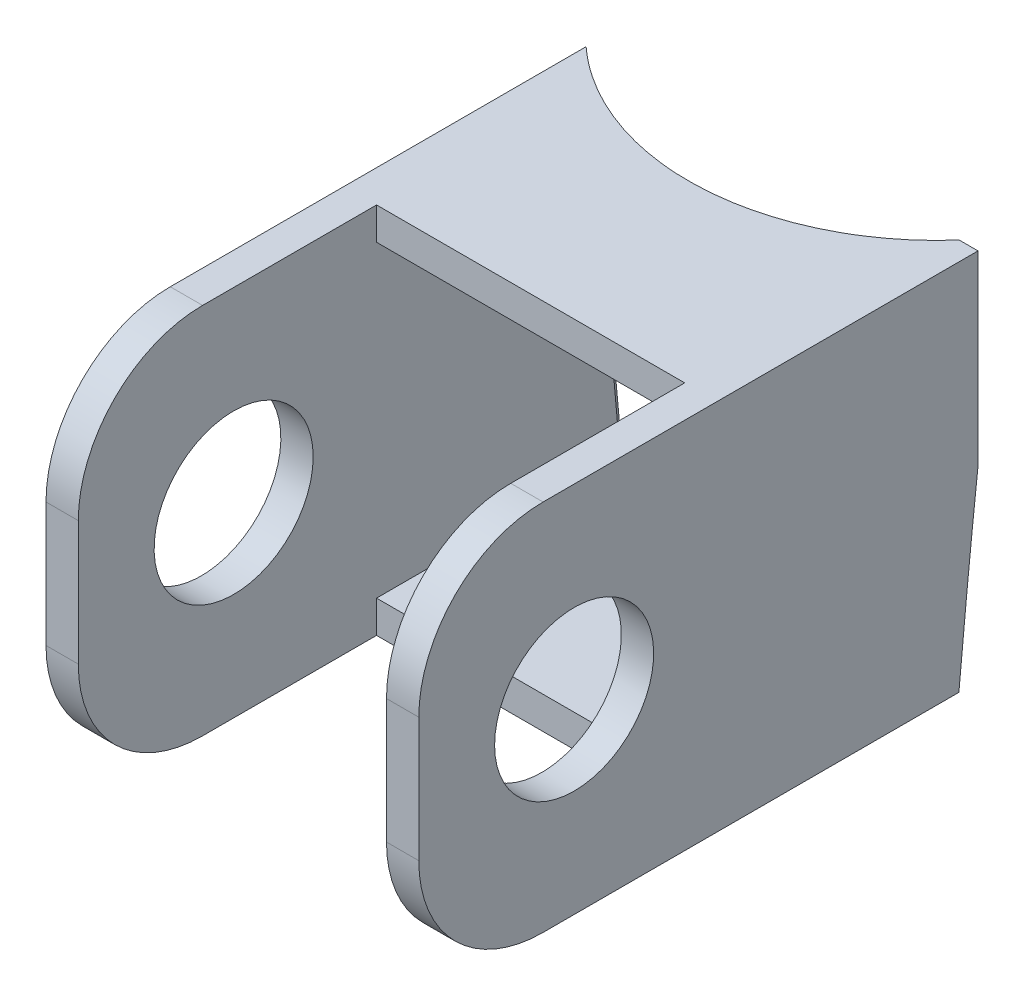
ISO-10303-21;
HEADER;
FILE_DESCRIPTION(('STEP AP214'),'2;1');
FILE_NAME('part.step','',(''),(''),'','','');
FILE_SCHEMA(('AUTOMOTIVE_DESIGN { 1 0 10303 214 1 1 1 1 }'));
ENDSEC;
DATA;
#1=APPLICATION_CONTEXT('core data for automotive mechanical design processes');
#2=APPLICATION_PROTOCOL_DEFINITION('international standard','automotive_design',2000,#1);
#3=PRODUCT_CONTEXT('',#1,'mechanical');
#4=PRODUCT('Part','Part','',(#3));
#5=PRODUCT_RELATED_PRODUCT_CATEGORY('part','',(#4));
#6=PRODUCT_DEFINITION_FORMATION('','',#4);
#7=PRODUCT_DEFINITION_CONTEXT('part definition',#1,'design');
#8=PRODUCT_DEFINITION('design','',#6,#7);
#9=PRODUCT_DEFINITION_SHAPE('','',#8);
#10=(LENGTH_UNIT() NAMED_UNIT(*) SI_UNIT(.MILLI.,.METRE.));
#11=(NAMED_UNIT(*) PLANE_ANGLE_UNIT() SI_UNIT($,.RADIAN.));
#12=(NAMED_UNIT(*) SI_UNIT($,.STERADIAN.) SOLID_ANGLE_UNIT());
#13=UNCERTAINTY_MEASURE_WITH_UNIT(LENGTH_MEASURE(1.E-05),#10,'distance_accuracy_value','');
#14=(GEOMETRIC_REPRESENTATION_CONTEXT(3) GLOBAL_UNCERTAINTY_ASSIGNED_CONTEXT((#13)) GLOBAL_UNIT_ASSIGNED_CONTEXT((#10,
#11,#12)) REPRESENTATION_CONTEXT('',''));
#15=CARTESIAN_POINT('',(0.,0.,0.));
#16=DIRECTION('',(0.,0.,1.));
#17=DIRECTION('',(1.,0.,0.));
#18=AXIS2_PLACEMENT_3D('',#15,#16,#17);
#19=CARTESIAN_POINT('',(0.,0.,0.));
#20=DIRECTION('',(0.,0.,1.));
#21=DIRECTION('',(1.,0.,0.));
#22=AXIS2_PLACEMENT_3D('',#19,#20,#21);
#23=PLANE('',#22);
#24=DIRECTION('',(0.,1.,0.));
#25=VECTOR('',#24,1.);
#26=CARTESIAN_POINT('',(9.525,9.525,0.));
#27=LINE('',#26,#25);
#28=CARTESIAN_POINT('',(9.525,0.,0.));
#29=VERTEX_POINT('',#28);
#30=CARTESIAN_POINT('',(9.525,9.525,0.));
#31=VERTEX_POINT('',#30);
#32=EDGE_CURVE('E205',#29,#31,#27,.T.);
#33=ORIENTED_EDGE('',*,*,#32,.F.);
#34=DIRECTION('',(-0.10018806161207,0.994968518250912,0.));
#35=VECTOR('',#34,1.);
#36=CARTESIAN_POINT('',(10.5700983819051,-10.3788811934186,0.));
#37=LINE('',#36,#35);
#38=CARTESIAN_POINT('',(8.56588293312783,9.525,0.));
#39=VERTEX_POINT('',#38);
#40=EDGE_CURVE('E314',#29,#39,#37,.T.);
#41=ORIENTED_EDGE('',*,*,#40,.T.);
#42=DIRECTION('',(-1.,0.,0.));
#43=VECTOR('',#42,1.);
#44=CARTESIAN_POINT('',(-9.525,9.525,0.));
#45=LINE('',#44,#43);
#46=EDGE_CURVE('E215',#31,#39,#45,.T.);
#47=ORIENTED_EDGE('',*,*,#46,.F.);
#48=EDGE_LOOP('',(#33,#41,#47));
#49=FACE_BOUND('',#48,.T.);
#50=ADVANCED_FACE('F41',(#49),#23,.F.);
#51=CARTESIAN_POINT('',(0.,0.,28.575));
#52=DIRECTION('',(0.,0.,1.));
#53=DIRECTION('',(1.,0.,0.));
#54=AXIS2_PLACEMENT_3D('',#51,#52,#53);
#55=PLANE('',#54);
#56=DIRECTION('',(0.,-1.,0.));
#57=VECTOR('',#56,1.);
#58=CARTESIAN_POINT('',(-7.874,7.874,28.575));
#59=LINE('',#58,#57);
#60=CARTESIAN_POINT('',(-7.874,3.175,28.575));
#61=VERTEX_POINT('',#60);
#62=CARTESIAN_POINT('',(-7.874,-3.175,28.575));
#63=VERTEX_POINT('',#62);
#64=EDGE_CURVE('E193',#61,#63,#59,.T.);
#65=ORIENTED_EDGE('',*,*,#64,.F.);
#66=DIRECTION('',(-1.,0.,0.));
#67=VECTOR('',#66,1.);
#68=CARTESIAN_POINT('',(-9.525,3.175,28.575));
#69=LINE('',#68,#67);
#70=CARTESIAN_POINT('',(-9.525,3.175,28.575));
#71=VERTEX_POINT('',#70);
#72=EDGE_CURVE('E242',#61,#71,#69,.T.);
#73=ORIENTED_EDGE('',*,*,#72,.T.);
#74=DIRECTION('',(0.,-1.,0.));
#75=VECTOR('',#74,1.);
#76=CARTESIAN_POINT('',(-9.525,9.525,28.575));
#77=LINE('',#76,#75);
#78=CARTESIAN_POINT('',(-9.525,-3.175,28.575));
#79=VERTEX_POINT('',#78);
#80=EDGE_CURVE('E209',#71,#79,#77,.T.);
#81=ORIENTED_EDGE('',*,*,#80,.T.);
#82=DIRECTION('',(1.,0.,0.));
#83=VECTOR('',#82,1.);
#84=CARTESIAN_POINT('',(-7.874,-3.175,28.575));
#85=LINE('',#84,#83);
#86=EDGE_CURVE('E239',#79,#63,#85,.T.);
#87=ORIENTED_EDGE('',*,*,#86,.T.);
#88=EDGE_LOOP('',(#65,#73,#81,#87));
#89=FACE_BOUND('',#88,.T.);
#90=ADVANCED_FACE('F291',(#89),#55,.T.);
#91=DIRECTION('',(0.,1.,0.));
#92=VECTOR('',#91,1.);
#93=CARTESIAN_POINT('',(9.525,9.525,28.575));
#94=LINE('',#93,#92);
#95=CARTESIAN_POINT('',(9.525,-3.175,28.575));
#96=VERTEX_POINT('',#95);
#97=CARTESIAN_POINT('',(9.525,3.175,28.575));
#98=VERTEX_POINT('',#97);
#99=EDGE_CURVE('E206',#96,#98,#94,.T.);
#100=ORIENTED_EDGE('',*,*,#99,.T.);
#101=DIRECTION('',(-1.,0.,0.));
#102=VECTOR('',#101,1.);
#103=CARTESIAN_POINT('',(7.874,3.175,28.575));
#104=LINE('',#103,#102);
#105=CARTESIAN_POINT('',(7.874,3.175,28.575));
#106=VERTEX_POINT('',#105);
#107=EDGE_CURVE('E260',#98,#106,#104,.T.);
#108=ORIENTED_EDGE('',*,*,#107,.T.);
#109=DIRECTION('',(0.,1.,0.));
#110=VECTOR('',#109,1.);
#111=CARTESIAN_POINT('',(7.874,7.874,28.575));
#112=LINE('',#111,#110);
#113=CARTESIAN_POINT('',(7.874,-3.175,28.575));
#114=VERTEX_POINT('',#113);
#115=EDGE_CURVE('E198',#114,#106,#112,.T.);
#116=ORIENTED_EDGE('',*,*,#115,.F.);
#117=DIRECTION('',(1.,0.,0.));
#118=VECTOR('',#117,1.);
#119=CARTESIAN_POINT('',(9.525,-3.175,28.575));
#120=LINE('',#119,#118);
#121=EDGE_CURVE('E257',#114,#96,#120,.T.);
#122=ORIENTED_EDGE('',*,*,#121,.T.);
#123=EDGE_LOOP('',(#100,#108,#116,#122));
#124=FACE_BOUND('',#123,.T.);
#125=ADVANCED_FACE('F362',(#124),#55,.T.);
#126=DIRECTION('',(0.,-1.,0.));
#127=VECTOR('',#126,1.);
#128=CARTESIAN_POINT('',(-9.525,9.525,0.));
#129=LINE('',#128,#127);
#130=CARTESIAN_POINT('',(-9.525,0.,0.));
#131=VERTEX_POINT('',#130);
#132=CARTESIAN_POINT('',(-9.525,-9.525,0.));
#133=VERTEX_POINT('',#132);
#134=EDGE_CURVE('E218',#131,#133,#129,.T.);
#135=ORIENTED_EDGE('',*,*,#134,.F.);
#136=DIRECTION('',(-0.10018806161207,0.994968518250912,0.));
#137=VECTOR('',#136,1.);
#138=CARTESIAN_POINT('',(-8.47990161809487,-10.3788811934186,0.));
#139=LINE('',#138,#137);
#140=CARTESIAN_POINT('',(-8.56588293312783,-9.525,0.));
#141=VERTEX_POINT('',#140);
#142=EDGE_CURVE('E407',#131,#141,#139,.F.);
#143=ORIENTED_EDGE('',*,*,#142,.T.);
#144=DIRECTION('',(1.,0.,0.));
#145=VECTOR('',#144,1.);
#146=CARTESIAN_POINT('',(-9.525,-9.525,0.));
#147=LINE('',#146,#145);
#148=EDGE_CURVE('E210',#133,#141,#147,.T.);
#149=ORIENTED_EDGE('',*,*,#148,.F.);
#150=EDGE_LOOP('',(#135,#143,#149));
#151=FACE_BOUND('',#150,.T.);
#152=ADVANCED_FACE('F382',(#151),#23,.F.);
#153=CARTESIAN_POINT('',(9.525,9.525,28.575));
#154=DIRECTION('',(-1.,0.,0.));
#155=DIRECTION('',(0.,-1.,0.));
#156=AXIS2_PLACEMENT_3D('',#153,#154,#155);
#157=PLANE('',#156);
#158=CARTESIAN_POINT('',(9.52500000000001,0.,20.6375));
#159=DIRECTION('',(-1.,0.,0.));
#160=DIRECTION('',(0.,-1.,0.));
#161=AXIS2_PLACEMENT_3D('',#158,#159,#160);
#162=CIRCLE('',#161,4.064);
#163=CARTESIAN_POINT('',(9.52500000000001,-4.064,20.6375));
#164=VERTEX_POINT('',#163);
#165=EDGE_CURVE('E418',#164,#164,#162,.T.);
#166=ORIENTED_EDGE('',*,*,#165,.T.);
#167=EDGE_LOOP('',(#166));
#168=FACE_BOUND('',#167,.T.);
#169=DIRECTION('',(0.,0.,-1.));
#170=VECTOR('',#169,1.);
#171=CARTESIAN_POINT('',(9.525,-9.525,28.575));
#172=LINE('',#171,#170);
#173=CARTESIAN_POINT('',(9.525,-9.525,22.225));
#174=VERTEX_POINT('',#173);
#175=CARTESIAN_POINT('',(9.525,-9.525,0.97607413643289));
#176=VERTEX_POINT('',#175);
#177=EDGE_CURVE('E213',#174,#176,#172,.T.);
#178=ORIENTED_EDGE('',*,*,#177,.T.);
#179=CARTESIAN_POINT('',(9.52499999999994,-9.525,0.976074136432891));
#180=CARTESIAN_POINT('',(9.52499999999998,-9.1277064272393,0.939526221320908));
#181=CARTESIAN_POINT('',(9.525,-8.73045552857944,0.902513399261914));
#182=CARTESIAN_POINT('',(9.52500000000001,-7.93605318233662,0.82752374373459));
#183=CARTESIAN_POINT('',(9.52500000000001,-7.5389017328361,0.789546930576719));
#184=CARTESIAN_POINT('',(9.525,-6.74470163512735,0.712594138451446));
#185=CARTESIAN_POINT('',(9.525,-6.34765298546219,0.673618174527102));
#186=CARTESIAN_POINT('',(9.525,-5.55366224088991,0.59462844622898));
#187=CARTESIAN_POINT('',(9.525,-5.15672014512228,0.554614690507607));
#188=CARTESIAN_POINT('',(9.525,-4.36294530639579,0.473507701993614));
#189=CARTESIAN_POINT('',(9.525,-3.96611256368567,0.432414466765917));
#190=CARTESIAN_POINT('',(9.525,-3.17256247345392,0.349103506553159));
#191=CARTESIAN_POINT('',(9.525,-2.77584512670334,0.306885774221373));
#192=CARTESIAN_POINT('',(9.525,-1.98253104190467,0.221277161487796));
#193=CARTESIAN_POINT('',(9.525,-1.58593430572034,0.177886263804821));
#194=CARTESIAN_POINT('',(9.525,-0.792867409981158,0.0898769888508262));
#195=CARTESIAN_POINT('',(9.525,-0.396397253705394,0.045258582037538));
#196=CARTESIAN_POINT('',(9.525,0.,0.));
#197=B_SPLINE_CURVE_WITH_KNOTS('',3,(#179,#180,#181,#182,#183,#184,#185,#186,#187,#188,#189,
#190,#191,#192,#193,#194,#195,#196),.UNSPECIFIED.,.F.,.F.,(4,2,2,2,2,2,2,2,4),(0.,
1.19691314331896,2.39380108961143,3.59067102631726,4.78753098753862,5.98439364885425,
7.18126413160279,8.37815225433768,9.57506920763329),.UNSPECIFIED.);
#198=EDGE_CURVE('E62',#176,#29,#197,.T.);
#199=ORIENTED_EDGE('',*,*,#198,.T.);
#200=ORIENTED_EDGE('',*,*,#32,.T.);
#201=DIRECTION('',(0.,0.,-1.));
#202=VECTOR('',#201,1.);
#203=CARTESIAN_POINT('',(9.525,9.525,28.575));
#204=LINE('',#203,#202);
#205=CARTESIAN_POINT('',(9.525,9.525,22.225));
#206=VERTEX_POINT('',#205);
#207=EDGE_CURVE('E230',#206,#31,#204,.T.);
#208=ORIENTED_EDGE('',*,*,#207,.F.);
#209=CARTESIAN_POINT('',(9.525,3.175,22.225));
#210=DIRECTION('',(-1.,0.,0.));
#211=DIRECTION('',(0.,-1.,0.));
#212=AXIS2_PLACEMENT_3D('',#209,#210,#211);
#213=CIRCLE('',#212,6.35);
#214=EDGE_CURVE('E269',#206,#98,#213,.F.);
#215=ORIENTED_EDGE('',*,*,#214,.T.);
#216=ORIENTED_EDGE('',*,*,#99,.F.);
#217=CARTESIAN_POINT('',(9.525,-3.175,22.225));
#218=DIRECTION('',(-1.,0.,0.));
#219=DIRECTION('',(0.,-1.,0.));
#220=AXIS2_PLACEMENT_3D('',#217,#218,#219);
#221=CIRCLE('',#220,6.35);
#222=EDGE_CURVE('E267',#96,#174,#221,.F.);
#223=ORIENTED_EDGE('',*,*,#222,.T.);
#224=EDGE_LOOP('',(#178,#199,#200,#208,#215,#216,#223));
#225=FACE_BOUND('',#224,.T.);
#226=ADVANCED_FACE('F389',(#168,#225),#157,.F.);
#227=CARTESIAN_POINT('',(-9.525,9.525,28.575));
#228=DIRECTION('',(0.,-1.,0.));
#229=DIRECTION('',(0.,0.,-1.));
#230=AXIS2_PLACEMENT_3D('',#227,#228,#229);
#231=PLANE('',#230);
#232=ORIENTED_EDGE('',*,*,#46,.T.);
#233=CARTESIAN_POINT('',(8.56588293312783,9.525,0.));
#234=CARTESIAN_POINT('',(8.33312014434595,9.525,0.263982900761339));
#235=CARTESIAN_POINT('',(8.089335336482,9.525,0.518238316273924));
#236=CARTESIAN_POINT('',(7.58152867443279,9.525,1.00564061623721));
#237=CARTESIAN_POINT('',(7.31750783397583,9.525,1.23878855679668));
#238=CARTESIAN_POINT('',(6.77100507951902,9.525,1.68235507531954));
#239=CARTESIAN_POINT('',(6.48852266883857,9.525,1.892773041363));
#240=CARTESIAN_POINT('',(5.90706329338011,9.525,2.28942650659204));
#241=CARTESIAN_POINT('',(5.60808639069201,9.525,2.47566209679804));
#242=CARTESIAN_POINT('',(4.99576743042289,9.525,2.82262503797814));
#243=CARTESIAN_POINT('',(4.68242853888995,9.525,2.98335797639248));
#244=CARTESIAN_POINT('',(4.04334672833901,9.525,3.27832109112494));
#245=CARTESIAN_POINT('',(3.71759838003734,9.525,3.41253950442194));
#246=CARTESIAN_POINT('',(3.05607927194578,9.525,3.65345742027777));
#247=CARTESIAN_POINT('',(2.72030848101994,9.525,3.76015683733551));
#248=CARTESIAN_POINT('',(2.04121430410955,9.525,3.94525728254998));
#249=CARTESIAN_POINT('',(1.69789437433722,9.525,4.02367098585546));
#250=CARTESIAN_POINT('',(1.00579212416971,9.525,4.15175361058599));
#251=CARTESIAN_POINT('',(0.657007508166302,9.525,4.20141010003733));
#252=CARTESIAN_POINT('',(-0.043380174782652,9.525,4.27156660801607));
#253=CARTESIAN_POINT('',(-0.394982012245475,9.525,4.29207871564242));
#254=CARTESIAN_POINT('',(-0.922091921803949,9.525,4.3008973957611));
#255=CARTESIAN_POINT('',(-1.09747898472358,9.525,4.30019642551258));
#256=CARTESIAN_POINT('',(-1.448073529362,9.525,4.29153494649575));
#257=CARTESIAN_POINT('',(-1.62328101131704,9.525,4.28357444729002));
#258=CARTESIAN_POINT('',(-2.14931126324412,9.525,4.24873788543539));
#259=CARTESIAN_POINT('',(-2.49947038172184,9.525,4.21088880985538));
#260=CARTESIAN_POINT('',(-3.19553926818018,9.525,4.10623290468059));
#261=CARTESIAN_POINT('',(-3.54144718799825,9.525,4.03941390889134));
#262=CARTESIAN_POINT('',(-4.2264561916853,9.525,3.87729346253786));
#263=CARTESIAN_POINT('',(-4.56555873254606,9.525,3.78199817952386));
#264=CARTESIAN_POINT('',(-5.23467964451342,9.525,3.5635781769271));
#265=CARTESIAN_POINT('',(-5.56469790047024,9.525,3.44045310476403));
#266=CARTESIAN_POINT('',(-6.2173055243511,9.525,3.16556518349968));
#267=CARTESIAN_POINT('',(-6.53975640487693,9.525,3.01347337841236));
#268=CARTESIAN_POINT('',(-7.17075540485726,9.525,2.68272082800671));
#269=CARTESIAN_POINT('',(-7.47930255408311,9.525,2.50405823225791));
#270=CARTESIAN_POINT('',(-8.08922437627035,9.525,2.11572938455417));
#271=CARTESIAN_POINT('',(-8.39011306744058,9.525,1.90529928687816));
#272=CARTESIAN_POINT('',(-8.97259459599483,9.525,1.45920499152843));
#273=CARTESIAN_POINT('',(-9.25418613802434,9.525,1.22353910257428));
#274=CARTESIAN_POINT('',(-9.52499999999984,9.525,0.976074136432908));
#275=B_SPLINE_CURVE_WITH_KNOTS('',3,(#233,#234,#235,#236,#237,#238,#239,#240,#241,#242,#243,
#244,#245,#246,#247,#248,#249,#250,#251,#252,#253,#254,#255,#256,#257,#258,#259,#260,#261,#262,
#263,#264,#265,#266,#267,#268,#269,#270,#271,#272,#273,#274),.UNSPECIFIED.,.F.,.F.,(4,2,2,2,2,2,
2,2,2,2,2,2,2,2,2,2,2,2,2,2,4),(0.,1.05552304057624,2.11099323902187,3.1664918449947,
4.22198647804487,5.27724953983794,6.33297971697848,7.38871317421636,8.44397295590957,
9.49968859496093,10.554966194854,11.0810018819451,11.6070368761185,12.6623116942617,
13.7180301150609,14.773520048107,15.8290233540838,16.897317406298,17.9656858910117,
19.0658181266106,20.1660241382982),.UNSPECIFIED.);
#276=CARTESIAN_POINT('',(-9.5249999999999,9.52500000000001,0.976074136432989));
#277=VERTEX_POINT('',#276);
#278=EDGE_CURVE('E307',#39,#277,#275,.T.);
#279=ORIENTED_EDGE('',*,*,#278,.T.);
#280=DIRECTION('',(0.,0.,-1.));
#281=VECTOR('',#280,1.);
#282=CARTESIAN_POINT('',(-9.525,9.525,28.575));
#283=LINE('',#282,#281);
#284=CARTESIAN_POINT('',(-9.525,9.525,22.225));
#285=VERTEX_POINT('',#284);
#286=EDGE_CURVE('E227',#285,#277,#283,.T.);
#287=ORIENTED_EDGE('',*,*,#286,.F.);
#288=DIRECTION('',(-1.,0.,0.));
#289=VECTOR('',#288,1.);
#290=CARTESIAN_POINT('',(-7.874,9.525,22.225));
#291=LINE('',#290,#289);
#292=CARTESIAN_POINT('',(-7.874,9.525,22.225));
#293=VERTEX_POINT('',#292);
#294=EDGE_CURVE('E251',#285,#293,#291,.F.);
#295=ORIENTED_EDGE('',*,*,#294,.T.);
#296=DIRECTION('',(0.,0.,-1.));
#297=VECTOR('',#296,1.);
#298=CARTESIAN_POINT('',(-7.874,9.525,28.575));
#299=LINE('',#298,#297);
#300=CARTESIAN_POINT('',(-7.874,9.525,13.335));
#301=VERTEX_POINT('',#300);
#302=EDGE_CURVE('E299',#293,#301,#299,.T.);
#303=ORIENTED_EDGE('',*,*,#302,.T.);
#304=DIRECTION('',(1.,0.,0.));
#305=VECTOR('',#304,1.);
#306=CARTESIAN_POINT('',(-7.874,9.525,13.335));
#307=LINE('',#306,#305);
#308=CARTESIAN_POINT('',(7.874,9.525,13.335));
#309=VERTEX_POINT('',#308);
#310=EDGE_CURVE('E312',#301,#309,#307,.T.);
#311=ORIENTED_EDGE('',*,*,#310,.T.);
#312=DIRECTION('',(0.,0.,1.));
#313=VECTOR('',#312,1.);
#314=CARTESIAN_POINT('',(7.874,9.525,28.575));
#315=LINE('',#314,#313);
#316=CARTESIAN_POINT('',(7.874,9.525,22.225));
#317=VERTEX_POINT('',#316);
#318=EDGE_CURVE('E438',#309,#317,#315,.T.);
#319=ORIENTED_EDGE('',*,*,#318,.T.);
#320=DIRECTION('',(-1.,0.,0.));
#321=VECTOR('',#320,1.);
#322=CARTESIAN_POINT('',(9.525,9.525,22.225));
#323=LINE('',#322,#321);
#324=EDGE_CURVE('E249',#317,#206,#323,.F.);
#325=ORIENTED_EDGE('',*,*,#324,.T.);
#326=ORIENTED_EDGE('',*,*,#207,.T.);
#327=EDGE_LOOP('',(#232,#279,#287,#295,#303,#311,#319,#325,#326));
#328=FACE_BOUND('',#327,.T.);
#329=ADVANCED_FACE('F306',(#328),#231,.F.);
#330=CARTESIAN_POINT('',(-9.525,9.525,28.575));
#331=DIRECTION('',(1.,0.,0.));
#332=DIRECTION('',(0.,1.,0.));
#333=AXIS2_PLACEMENT_3D('',#330,#331,#332);
#334=PLANE('',#333);
#335=CARTESIAN_POINT('',(-9.525,0.,20.6375));
#336=DIRECTION('',(1.,0.,0.));
#337=DIRECTION('',(0.,1.,0.));
#338=AXIS2_PLACEMENT_3D('',#335,#336,#337);
#339=CIRCLE('',#338,4.064);
#340=CARTESIAN_POINT('',(-9.525,4.064,20.6375));
#341=VERTEX_POINT('',#340);
#342=EDGE_CURVE('E237',#341,#341,#339,.T.);
#343=ORIENTED_EDGE('',*,*,#342,.T.);
#344=EDGE_LOOP('',(#343));
#345=FACE_BOUND('',#344,.T.);
#346=ORIENTED_EDGE('',*,*,#286,.T.);
#347=CARTESIAN_POINT('',(-9.5249999999999,9.52500000000001,0.976074136432989));
#348=CARTESIAN_POINT('',(-9.52499999999996,9.1277064272393,0.939526221320949));
#349=CARTESIAN_POINT('',(-9.52499999999999,8.73045552857944,0.90251339926193));
#350=CARTESIAN_POINT('',(-9.52500000000001,7.93605318233662,0.827523743734586));
#351=CARTESIAN_POINT('',(-9.525,7.53890173283609,0.789546930576719));
#352=CARTESIAN_POINT('',(-9.525,6.74470163512733,0.712594138451451));
#353=CARTESIAN_POINT('',(-9.525,6.34765298546217,0.673618174527107));
#354=CARTESIAN_POINT('',(-9.525,5.55366224088989,0.594628446228984));
#355=CARTESIAN_POINT('',(-9.525,5.15672014512225,0.55461469050761));
#356=CARTESIAN_POINT('',(-9.525,4.36294530639576,0.473507701993616));
#357=CARTESIAN_POINT('',(-9.525,3.96611256368563,0.432414466765919));
#358=CARTESIAN_POINT('',(-9.525,3.17256247345387,0.349103506553161));
#359=CARTESIAN_POINT('',(-9.525,2.77584512670329,0.306885774221375));
#360=CARTESIAN_POINT('',(-9.525,1.98253104190462,0.221277161487796));
#361=CARTESIAN_POINT('',(-9.525,1.58593430572028,0.17788626380482));
#362=CARTESIAN_POINT('',(-9.525,0.792867409981093,0.0898769888508242));
#363=CARTESIAN_POINT('',(-9.525,0.396397253705325,0.0452585820375363));
#364=CARTESIAN_POINT('',(-9.52499999999999,0.,0.));
#365=B_SPLINE_CURVE_WITH_KNOTS('',3,(#347,#348,#349,#350,#351,#352,#353,#354,#355,#356,#357,
#358,#359,#360,#361,#362,#363,#364),.UNSPECIFIED.,.F.,.F.,(4,2,2,2,2,2,2,2,4),(0.,
1.19691314331898,2.39380108961145,3.59067102631729,4.78753098753866,5.9843936488543,
7.18126413160286,8.37815225433775,9.57506920763337),.UNSPECIFIED.);
#366=EDGE_CURVE('E310',#277,#131,#365,.T.);
#367=ORIENTED_EDGE('',*,*,#366,.T.);
#368=ORIENTED_EDGE('',*,*,#134,.T.);
#369=DIRECTION('',(0.,0.,-1.));
#370=VECTOR('',#369,1.);
#371=CARTESIAN_POINT('',(-9.525,-9.525,28.575));
#372=LINE('',#371,#370);
#373=CARTESIAN_POINT('',(-9.525,-9.525,22.225));
#374=VERTEX_POINT('',#373);
#375=EDGE_CURVE('E224',#374,#133,#372,.T.);
#376=ORIENTED_EDGE('',*,*,#375,.F.);
#377=CARTESIAN_POINT('',(-9.525,-3.175,22.225));
#378=DIRECTION('',(1.,0.,0.));
#379=DIRECTION('',(0.,1.,0.));
#380=AXIS2_PLACEMENT_3D('',#377,#378,#379);
#381=CIRCLE('',#380,6.35);
#382=EDGE_CURVE('E245',#374,#79,#381,.F.);
#383=ORIENTED_EDGE('',*,*,#382,.T.);
#384=ORIENTED_EDGE('',*,*,#80,.F.);
#385=CARTESIAN_POINT('',(-9.525,3.175,22.225));
#386=DIRECTION('',(1.,0.,0.));
#387=DIRECTION('',(0.,1.,0.));
#388=AXIS2_PLACEMENT_3D('',#385,#386,#387);
#389=CIRCLE('',#388,6.35);
#390=EDGE_CURVE('E247',#71,#285,#389,.F.);
#391=ORIENTED_EDGE('',*,*,#390,.T.);
#392=EDGE_LOOP('',(#346,#367,#368,#376,#383,#384,#391));
#393=FACE_BOUND('',#392,.T.);
#394=ADVANCED_FACE('F283',(#345,#393),#334,.F.);
#395=CARTESIAN_POINT('',(-9.525,-9.525,28.575));
#396=DIRECTION('',(0.,1.,0.));
#397=DIRECTION('',(0.,0.,1.));
#398=AXIS2_PLACEMENT_3D('',#395,#396,#397);
#399=PLANE('',#398);
#400=ORIENTED_EDGE('',*,*,#148,.T.);
#401=CARTESIAN_POINT('',(-8.56588293312783,-9.525,0.));
#402=CARTESIAN_POINT('',(-8.33312014434595,-9.525,0.26398290076134));
#403=CARTESIAN_POINT('',(-8.089335336482,-9.525,0.518238316273925));
#404=CARTESIAN_POINT('',(-7.58152867443279,-9.525,1.00564061623721));
#405=CARTESIAN_POINT('',(-7.31750783397583,-9.525,1.23878855679668));
#406=CARTESIAN_POINT('',(-6.77100507951902,-9.525,1.68235507531954));
#407=CARTESIAN_POINT('',(-6.48852266883858,-9.525,1.892773041363));
#408=CARTESIAN_POINT('',(-5.90706329338011,-9.525,2.28942650659204));
#409=CARTESIAN_POINT('',(-5.60808639069201,-9.525,2.47566209679804));
#410=CARTESIAN_POINT('',(-4.9957674304229,-9.525,2.82262503797814));
#411=CARTESIAN_POINT('',(-4.68242853888995,-9.525,2.98335797639248));
#412=CARTESIAN_POINT('',(-4.04334672833902,-9.525,3.27832109112493));
#413=CARTESIAN_POINT('',(-3.71759838003735,-9.525,3.41253950442194));
#414=CARTESIAN_POINT('',(-3.05607927194579,-9.525,3.65345742027777));
#415=CARTESIAN_POINT('',(-2.72030848101995,-9.525,3.76015683733551));
#416=CARTESIAN_POINT('',(-2.04121430410956,-9.525,3.94525728254998));
#417=CARTESIAN_POINT('',(-1.69789437433723,-9.525,4.02367098585546));
#418=CARTESIAN_POINT('',(-1.00579212416972,-9.525,4.15175361058599));
#419=CARTESIAN_POINT('',(-0.657007508166316,-9.525,4.20141010003733));
#420=CARTESIAN_POINT('',(0.0433801747826377,-9.525,4.27156660801607));
#421=CARTESIAN_POINT('',(0.39498201224546,-9.525,4.29207871564242));
#422=CARTESIAN_POINT('',(0.922091921803934,-9.525,4.3008973957611));
#423=CARTESIAN_POINT('',(1.09747898472356,-9.525,4.30019642551258));
#424=CARTESIAN_POINT('',(1.44807352936198,-9.525,4.29153494649575));
#425=CARTESIAN_POINT('',(1.62328101131703,-9.525,4.28357444729002));
#426=CARTESIAN_POINT('',(2.14931126324411,-9.525,4.24873788543539));
#427=CARTESIAN_POINT('',(2.49947038172183,-9.525,4.21088880985539));
#428=CARTESIAN_POINT('',(3.19553926818017,-9.525,4.10623290468059));
#429=CARTESIAN_POINT('',(3.54144718799823,-9.525,4.03941390889134));
#430=CARTESIAN_POINT('',(4.22645619168529,-9.525,3.87729346253787));
#431=CARTESIAN_POINT('',(4.56555873254605,-9.525,3.78199817952386));
#432=CARTESIAN_POINT('',(5.23467964451341,-9.525,3.5635781769271));
#433=CARTESIAN_POINT('',(5.56469790047024,-9.525,3.44045310476403));
#434=CARTESIAN_POINT('',(6.2173055243511,-9.525,3.16556518349968));
#435=CARTESIAN_POINT('',(6.53975640487694,-9.525,3.01347337841236));
#436=CARTESIAN_POINT('',(7.17075540485728,-9.525,2.68272082800671));
#437=CARTESIAN_POINT('',(7.47930255408314,-9.525,2.50405823225789));
#438=CARTESIAN_POINT('',(8.08922437627038,-9.525,2.11572938455414));
#439=CARTESIAN_POINT('',(8.39011306744062,-9.525,1.90529928687813));
#440=CARTESIAN_POINT('',(8.97259459599489,-9.525,1.45920499152838));
#441=CARTESIAN_POINT('',(9.2541861380244,-9.525,1.22353910257423));
#442=CARTESIAN_POINT('',(9.52499999999991,-9.525,0.976074136432846));
#443=B_SPLINE_CURVE_WITH_KNOTS('',3,(#401,#402,#403,#404,#405,#406,#407,#408,#409,#410,#411,
#412,#413,#414,#415,#416,#417,#418,#419,#420,#421,#422,#423,#424,#425,#426,#427,#428,#429,#430,
#431,#432,#433,#434,#435,#436,#437,#438,#439,#440,#441,#442),.UNSPECIFIED.,.F.,.F.,(4,2,2,2,2,2,
2,2,2,2,2,2,2,2,2,2,2,2,2,2,4),(0.,1.05552304057624,2.11099323902187,3.1664918449947,
4.22198647804487,5.27724953983794,6.33297971697848,7.38871317421636,8.44397295590956,
9.49968859496092,10.5549661948539,11.0810018819451,11.6070368761185,12.6623116942617,
13.7180301150609,14.773520048107,15.8290233540838,16.897317406298,17.9656858910117,
19.0658181266107,20.1660241382983),.UNSPECIFIED.);
#444=EDGE_CURVE('E186',#141,#176,#443,.T.);
#445=ORIENTED_EDGE('',*,*,#444,.T.);
#446=ORIENTED_EDGE('',*,*,#177,.F.);
#447=DIRECTION('',(1.,0.,0.));
#448=VECTOR('',#447,1.);
#449=CARTESIAN_POINT('',(7.874,-9.525,22.225));
#450=LINE('',#449,#448);
#451=CARTESIAN_POINT('',(7.874,-9.525,22.225));
#452=VERTEX_POINT('',#451);
#453=EDGE_CURVE('E271',#174,#452,#450,.F.);
#454=ORIENTED_EDGE('',*,*,#453,.T.);
#455=DIRECTION('',(0.,0.,-1.));
#456=VECTOR('',#455,1.);
#457=CARTESIAN_POINT('',(7.874,-9.525,28.575));
#458=LINE('',#457,#456);
#459=CARTESIAN_POINT('',(7.874,-9.525,13.335));
#460=VERTEX_POINT('',#459);
#461=EDGE_CURVE('E430',#452,#460,#458,.T.);
#462=ORIENTED_EDGE('',*,*,#461,.T.);
#463=DIRECTION('',(-1.,0.,0.));
#464=VECTOR('',#463,1.);
#465=CARTESIAN_POINT('',(-9.525,-9.525,13.335));
#466=LINE('',#465,#464);
#467=CARTESIAN_POINT('',(-7.874,-9.525,13.335));
#468=VERTEX_POINT('',#467);
#469=EDGE_CURVE('E425',#460,#468,#466,.T.);
#470=ORIENTED_EDGE('',*,*,#469,.T.);
#471=DIRECTION('',(0.,0.,1.));
#472=VECTOR('',#471,1.);
#473=CARTESIAN_POINT('',(-7.874,-9.525,28.575));
#474=LINE('',#473,#472);
#475=CARTESIAN_POINT('',(-7.874,-9.525,22.225));
#476=VERTEX_POINT('',#475);
#477=EDGE_CURVE('E279',#468,#476,#474,.T.);
#478=ORIENTED_EDGE('',*,*,#477,.T.);
#479=DIRECTION('',(1.,0.,0.));
#480=VECTOR('',#479,1.);
#481=CARTESIAN_POINT('',(-9.525,-9.525,22.225));
#482=LINE('',#481,#480);
#483=EDGE_CURVE('E55',#476,#374,#482,.F.);
#484=ORIENTED_EDGE('',*,*,#483,.T.);
#485=ORIENTED_EDGE('',*,*,#375,.T.);
#486=EDGE_LOOP('',(#400,#445,#446,#454,#462,#470,#478,#484,#485));
#487=FACE_BOUND('',#486,.T.);
#488=ADVANCED_FACE('F276',(#487),#399,.F.);
#489=CARTESIAN_POINT('',(7.874,7.874,28.575));
#490=DIRECTION('',(-1.,0.,0.));
#491=DIRECTION('',(0.,0.,1.));
#492=AXIS2_PLACEMENT_3D('',#489,#490,#491);
#493=PLANE('',#492);
#494=CARTESIAN_POINT('',(7.87399999999952,-9.52500000000004,2.25217564778142));
#495=CARTESIAN_POINT('',(7.87399999999983,-8.73032567049656,2.20022966147632));
#496=CARTESIAN_POINT('',(7.87399999999996,-7.93573399029001,2.14701221155869));
#497=CARTESIAN_POINT('',(7.87400000000005,-6.34676818333017,2.03791031093402));
#498=CARTESIAN_POINT('',(7.87400000000001,-5.55239404868471,1.98202597512425));
#499=CARTESIAN_POINT('',(7.87399999999999,-3.9638721894863,1.86746358317125));
#500=CARTESIAN_POINT('',(7.874,-3.16972445859024,1.80878561507638));
#501=CARTESIAN_POINT('',(7.874,-1.58166598044228,1.68848982218156));
#502=CARTESIAN_POINT('',(7.874,-0.787755229159035,1.62687205064201));
#503=CARTESIAN_POINT('',(7.874,0.799824818652444,1.50053265773374));
#504=CARTESIAN_POINT('',(7.874,1.59349411354236,1.43581101575749));
#505=CARTESIAN_POINT('',(7.874,3.18056809317042,1.30307850630565));
#506=CARTESIAN_POINT('',(7.874,3.97397277438254,1.23506759663512));
#507=CARTESIAN_POINT('',(7.874,5.56049944296286,1.0955476613829));
#508=CARTESIAN_POINT('',(7.874,6.35362142095138,1.02403852896672));
#509=CARTESIAN_POINT('',(7.874,7.93956001432953,0.87727255639402));
#510=CARTESIAN_POINT('',(7.874,8.73237661166214,0.802015521226548));
#511=CARTESIAN_POINT('',(7.874,9.525,0.724762485036075));
#512=B_SPLINE_CURVE_WITH_KNOTS('',3,(#494,#495,#496,#497,#498,#499,#500,#501,#502,#503,#504,
#505,#506,#507,#508,#509,#510,#511),.UNSPECIFIED.,.F.,.F.,(4,2,2,2,2,2,2,2,4),(0.,
2.38911060071779,4.77811836430969,7.1670508820844,9.5559401360096,11.9448452526882,
14.3337810225304,16.7227897952337,19.1119230030301),.UNSPECIFIED.);
#513=CARTESIAN_POINT('',(7.87399999999997,-7.874,2.14239577361281));
#514=VERTEX_POINT('',#513);
#515=CARTESIAN_POINT('',(7.874,7.874,0.882808181342902));
#516=VERTEX_POINT('',#515);
#517=EDGE_CURVE('E170',#514,#516,#512,.T.);
#518=ORIENTED_EDGE('',*,*,#517,.F.);
#519=DIRECTION('',(0.,0.,-1.));
#520=VECTOR('',#519,1.);
#521=CARTESIAN_POINT('',(7.874,-7.874,28.575));
#522=LINE('',#521,#520);
#523=CARTESIAN_POINT('',(7.874,-7.874,13.335));
#524=VERTEX_POINT('',#523);
#525=EDGE_CURVE('E182',#524,#514,#522,.T.);
#526=ORIENTED_EDGE('',*,*,#525,.F.);
#527=DIRECTION('',(0.,-1.,0.));
#528=VECTOR('',#527,1.);
#529=CARTESIAN_POINT('',(7.874,9.525,13.335));
#530=LINE('',#529,#528);
#531=EDGE_CURVE('E435',#524,#460,#530,.T.);
#532=ORIENTED_EDGE('',*,*,#531,.T.);
#533=ORIENTED_EDGE('',*,*,#461,.F.);
#534=CARTESIAN_POINT('',(7.874,-3.175,22.225));
#535=DIRECTION('',(-1.,0.,0.));
#536=DIRECTION('',(0.,0.,1.));
#537=AXIS2_PLACEMENT_3D('',#534,#535,#536);
#538=CIRCLE('',#537,6.35);
#539=EDGE_CURVE('E263',#452,#114,#538,.T.);
#540=ORIENTED_EDGE('',*,*,#539,.T.);
#541=ORIENTED_EDGE('',*,*,#115,.T.);
#542=CARTESIAN_POINT('',(7.874,3.175,22.225));
#543=DIRECTION('',(-1.,0.,0.));
#544=DIRECTION('',(0.,0.,1.));
#545=AXIS2_PLACEMENT_3D('',#542,#543,#544);
#546=CIRCLE('',#545,6.35);
#547=EDGE_CURVE('E265',#106,#317,#546,.T.);
#548=ORIENTED_EDGE('',*,*,#547,.T.);
#549=ORIENTED_EDGE('',*,*,#318,.F.);
#550=CARTESIAN_POINT('',(7.874,7.874,13.335));
#551=VERTEX_POINT('',#550);
#552=EDGE_CURVE('E432',#309,#551,#530,.T.);
#553=ORIENTED_EDGE('',*,*,#552,.T.);
#554=DIRECTION('',(0.,0.,-1.));
#555=VECTOR('',#554,1.);
#556=CARTESIAN_POINT('',(7.874,7.874,28.575));
#557=LINE('',#556,#555);
#558=EDGE_CURVE('E185',#551,#516,#557,.T.);
#559=ORIENTED_EDGE('',*,*,#558,.T.);
#560=EDGE_LOOP('',(#518,#526,#532,#533,#540,#541,#548,#549,#553,#559));
#561=FACE_BOUND('',#560,.T.);
#562=CARTESIAN_POINT('',(7.874,0.,20.6375));
#563=DIRECTION('',(-1.,0.,0.));
#564=DIRECTION('',(0.,0.,1.));
#565=AXIS2_PLACEMENT_3D('',#562,#563,#564);
#566=CIRCLE('',#565,4.064);
#567=CARTESIAN_POINT('',(7.874,0.,24.7015));
#568=VERTEX_POINT('',#567);
#569=EDGE_CURVE('E236',#568,#568,#566,.T.);
#570=ORIENTED_EDGE('',*,*,#569,.F.);
#571=EDGE_LOOP('',(#570));
#572=FACE_BOUND('',#571,.T.);
#573=ADVANCED_FACE('F179',(#561,#572),#493,.T.);
#574=CARTESIAN_POINT('',(-7.874,7.874,28.575));
#575=DIRECTION('',(0.,-1.,0.));
#576=DIRECTION('',(0.,0.,-1.));
#577=AXIS2_PLACEMENT_3D('',#574,#575,#576);
#578=PLANE('',#577);
#579=CARTESIAN_POINT('',(7.874,7.874,0.882808181342902));
#580=CARTESIAN_POINT('',(7.61677106241733,7.874,1.1230120842571));
#581=CARTESIAN_POINT('',(7.34951385499551,7.874,1.352467051488));
#582=CARTESIAN_POINT('',(6.79689958960527,7.874,1.78840979699035));
#583=CARTESIAN_POINT('',(6.51154331442142,7.874,1.99489856748749));
#584=CARTESIAN_POINT('',(5.92465695786402,7.874,2.3834659630082));
#585=CARTESIAN_POINT('',(5.62312643171647,7.874,2.56554391627901));
#586=CARTESIAN_POINT('',(5.00599227558495,7.874,2.90403228236845));
#587=CARTESIAN_POINT('',(4.69038881175172,7.874,3.06044299812277));
#588=CARTESIAN_POINT('',(4.04728181136601,7.874,3.34651748376177));
#589=CARTESIAN_POINT('',(3.71977821253427,7.874,3.47618111364207));
#590=CARTESIAN_POINT('',(3.0551347221602,7.874,3.70786557592354));
#591=CARTESIAN_POINT('',(2.71799481775481,7.874,3.80988637142365));
#592=CARTESIAN_POINT('',(2.03640708487706,7.874,3.98558023826119));
#593=CARTESIAN_POINT('',(1.69195924298099,7.874,4.05925325752271));
#594=CARTESIAN_POINT('',(0.998137229824851,7.874,4.17774217982111));
#595=CARTESIAN_POINT('',(0.648763083249232,7.874,4.22255822740039));
#596=CARTESIAN_POINT('',(-0.0525004037617048,7.874,4.28302423011933));
#597=CARTESIAN_POINT('',(-0.404389746520352,7.874,4.29867415831426));
#598=CARTESIAN_POINT('',(-1.10825364984764,7.874,4.30069983618389));
#599=CARTESIAN_POINT('',(-1.46022821068216,7.874,4.28707549331355));
#600=CARTESIAN_POINT('',(-2.16182909894928,7.874,4.23064636726862));
#601=CARTESIAN_POINT('',(-2.51145543858549,7.874,4.18784173586162));
#602=CARTESIAN_POINT('',(-3.20594677462359,7.874,4.07334865641171));
#603=CARTESIAN_POINT('',(-3.55081173653162,7.874,4.0016599992315));
#604=CARTESIAN_POINT('',(-4.240809633628,7.874,3.82802617594544));
#605=CARTESIAN_POINT('',(-4.58578605919653,7.874,3.72545832817789));
#606=CARTESIAN_POINT('',(-5.26580631751435,7.874,3.49142470460608));
#607=CARTESIAN_POINT('',(-5.60084969137516,7.874,3.35995759606342));
#608=CARTESIAN_POINT('',(-6.26855227634196,7.874,3.06464622018852));
#609=CARTESIAN_POINT('',(-6.60083104333733,7.874,2.89994097406661));
#610=CARTESIAN_POINT('',(-7.24977096049521,7.874,2.54213619224635));
#611=CARTESIAN_POINT('',(-7.56643065738388,7.874,2.34903402099102));
#612=CARTESIAN_POINT('',(-7.87399999999926,7.874,2.14239577361326));
#613=B_SPLINE_CURVE_WITH_KNOTS('',3,(#579,#580,#581,#582,#583,#584,#585,#586,#587,#588,#589,
#590,#591,#592,#593,#594,#595,#596,#597,#598,#599,#600,#601,#602,#603,#604,#605,#606,#607,#608,
#609,#610,#611,#612),.UNSPECIFIED.,.F.,.F.,(4,2,2,2,2,2,2,2,2,2,2,2,2,2,2,2,4),(0.,
1.0555194295711,2.11099323902216,3.16649608772933,4.22198647804511,5.27748239305691,
6.33297971706812,7.38847898005823,8.44397295609111,9.49946790722713,10.5549661951141,
11.6104589933633,12.6659594341371,13.7443592920507,14.8228088926398,15.9339642159826,
17.0452227323151),.UNSPECIFIED.);
#614=CARTESIAN_POINT('',(-7.874,7.874,2.14239577361276));
#615=VERTEX_POINT('',#614);
#616=EDGE_CURVE('E187',#516,#615,#613,.T.);
#617=ORIENTED_EDGE('',*,*,#616,.F.);
#618=ORIENTED_EDGE('',*,*,#558,.F.);
#619=DIRECTION('',(1.,0.,0.));
#620=VECTOR('',#619,1.);
#621=CARTESIAN_POINT('',(-7.874,7.874,13.335));
#622=LINE('',#621,#620);
#623=CARTESIAN_POINT('',(-7.874,7.874,13.335));
#624=VERTEX_POINT('',#623);
#625=EDGE_CURVE('E427',#624,#551,#622,.T.);
#626=ORIENTED_EDGE('',*,*,#625,.F.);
#627=DIRECTION('',(0.,0.,-1.));
#628=VECTOR('',#627,1.);
#629=CARTESIAN_POINT('',(-7.874,7.874,28.575));
#630=LINE('',#629,#628);
#631=EDGE_CURVE('E195',#624,#615,#630,.T.);
#632=ORIENTED_EDGE('',*,*,#631,.T.);
#633=EDGE_LOOP('',(#617,#618,#626,#632));
#634=FACE_BOUND('',#633,.T.);
#635=ADVANCED_FACE('F353',(#634),#578,.T.);
#636=CARTESIAN_POINT('',(-7.874,7.874,28.575));
#637=DIRECTION('',(1.,0.,0.));
#638=DIRECTION('',(0.,0.,-1.));
#639=AXIS2_PLACEMENT_3D('',#636,#637,#638);
#640=PLANE('',#639);
#641=CARTESIAN_POINT('',(-7.8739999999994,9.52500000000004,2.25217564778163));
#642=CARTESIAN_POINT('',(-7.87399999999978,8.73032567049658,2.2002296614764));
#643=CARTESIAN_POINT('',(-7.87399999999994,7.93573399029003,2.14701221155871));
#644=CARTESIAN_POINT('',(-7.87400000000006,6.34676818333019,2.037910310934));
#645=CARTESIAN_POINT('',(-7.87400000000002,5.55239404868473,1.98202597512424));
#646=CARTESIAN_POINT('',(-7.87399999999999,3.96387218948632,1.86746358317125));
#647=CARTESIAN_POINT('',(-7.874,3.16972445859025,1.80878561507638));
#648=CARTESIAN_POINT('',(-7.874,1.58166598044229,1.68848982218156));
#649=CARTESIAN_POINT('',(-7.874,0.787755229159048,1.62687205064201));
#650=CARTESIAN_POINT('',(-7.874,-0.799824818652433,1.50053265773375));
#651=CARTESIAN_POINT('',(-7.874,-1.59349411354235,1.43581101575749));
#652=CARTESIAN_POINT('',(-7.874,-3.18056809317041,1.30307850630565));
#653=CARTESIAN_POINT('',(-7.874,-3.97397277438253,1.23506759663512));
#654=CARTESIAN_POINT('',(-7.874,-5.56049944296286,1.0955476613829));
#655=CARTESIAN_POINT('',(-7.874,-6.35362142095138,1.02403852896672));
#656=CARTESIAN_POINT('',(-7.874,-7.93956001432952,0.877272556394019));
#657=CARTESIAN_POINT('',(-7.874,-8.73237661166214,0.802015521226546));
#658=CARTESIAN_POINT('',(-7.87400000000001,-9.525,0.724762485036074));
#659=B_SPLINE_CURVE_WITH_KNOTS('',3,(#641,#642,#643,#644,#645,#646,#647,#648,#649,#650,#651,
#652,#653,#654,#655,#656,#657,#658),.UNSPECIFIED.,.F.,.F.,(4,2,2,2,2,2,2,2,4),(0.,
2.38911060071779,4.77811836430969,7.16705088208441,9.55594013600961,11.9448452526882,
14.3337810225304,16.7227897952337,19.1119230030301),.UNSPECIFIED.);
#660=CARTESIAN_POINT('',(-7.874,-7.874,0.882808181342905));
#661=VERTEX_POINT('',#660);
#662=EDGE_CURVE('E69',#615,#661,#659,.T.);
#663=ORIENTED_EDGE('',*,*,#662,.F.);
#664=ORIENTED_EDGE('',*,*,#631,.F.);
#665=DIRECTION('',(0.,-1.,0.));
#666=VECTOR('',#665,1.);
#667=CARTESIAN_POINT('',(-7.874,9.525,13.335));
#668=LINE('',#667,#666);
#669=EDGE_CURVE('E433',#301,#624,#668,.T.);
#670=ORIENTED_EDGE('',*,*,#669,.F.);
#671=ORIENTED_EDGE('',*,*,#302,.F.);
#672=CARTESIAN_POINT('',(-7.874,3.175,22.225));
#673=DIRECTION('',(1.,0.,0.));
#674=DIRECTION('',(0.,0.,-1.));
#675=AXIS2_PLACEMENT_3D('',#672,#673,#674);
#676=CIRCLE('',#675,6.35);
#677=EDGE_CURVE('E255',#293,#61,#676,.T.);
#678=ORIENTED_EDGE('',*,*,#677,.T.);
#679=ORIENTED_EDGE('',*,*,#64,.T.);
#680=CARTESIAN_POINT('',(-7.874,-3.175,22.225));
#681=DIRECTION('',(1.,0.,0.));
#682=DIRECTION('',(0.,0.,-1.));
#683=AXIS2_PLACEMENT_3D('',#680,#681,#682);
#684=CIRCLE('',#683,6.35);
#685=EDGE_CURVE('E253',#63,#476,#684,.T.);
#686=ORIENTED_EDGE('',*,*,#685,.T.);
#687=ORIENTED_EDGE('',*,*,#477,.F.);
#688=CARTESIAN_POINT('',(-7.874,-7.874,13.335));
#689=VERTEX_POINT('',#688);
#690=EDGE_CURVE('E436',#689,#468,#668,.T.);
#691=ORIENTED_EDGE('',*,*,#690,.F.);
#692=DIRECTION('',(0.,0.,-1.));
#693=VECTOR('',#692,1.);
#694=CARTESIAN_POINT('',(-7.874,-7.874,28.575));
#695=LINE('',#694,#693);
#696=EDGE_CURVE('E192',#689,#661,#695,.T.);
#697=ORIENTED_EDGE('',*,*,#696,.T.);
#698=EDGE_LOOP('',(#663,#664,#670,#671,#678,#679,#686,#687,#691,#697));
#699=FACE_BOUND('',#698,.T.);
#700=CARTESIAN_POINT('',(-7.874,0.,20.6375));
#701=DIRECTION('',(1.,0.,0.));
#702=DIRECTION('',(0.,0.,-1.));
#703=AXIS2_PLACEMENT_3D('',#700,#701,#702);
#704=CIRCLE('',#703,4.064);
#705=CARTESIAN_POINT('',(-7.874,0.,16.5735));
#706=VERTEX_POINT('',#705);
#707=EDGE_CURVE('E233',#706,#706,#704,.T.);
#708=ORIENTED_EDGE('',*,*,#707,.F.);
#709=EDGE_LOOP('',(#708));
#710=FACE_BOUND('',#709,.T.);
#711=ADVANCED_FACE('F294',(#699,#710),#640,.T.);
#712=CARTESIAN_POINT('',(-7.874,-7.874,28.575));
#713=DIRECTION('',(0.,1.,0.));
#714=DIRECTION('',(0.,0.,1.));
#715=AXIS2_PLACEMENT_3D('',#712,#713,#714);
#716=PLANE('',#715);
#717=CARTESIAN_POINT('',(-7.874,-7.874,0.882808181342904));
#718=CARTESIAN_POINT('',(-7.61677488884628,-7.874,1.12300852729745));
#719=CARTESIAN_POINT('',(-7.34952177289867,-7.874,1.35246026068269));
#720=CARTESIAN_POINT('',(-6.79690802352132,-7.874,1.78840368714743));
#721=CARTESIAN_POINT('',(-6.51154763741811,-7.874,1.99489569372701));
#722=CARTESIAN_POINT('',(-5.92465207671322,-7.874,2.38346920631329));
#723=CARTESIAN_POINT('',(-5.62311642658215,-7.874,2.56554999411419));
#724=CARTESIAN_POINT('',(-5.00598166949281,-7.874,2.90403750954383));
#725=CARTESIAN_POINT('',(-4.69038319842188,-7.874,3.06044539654528));
#726=CARTESIAN_POINT('',(-4.0472806040106,-7.874,3.3465181194));
#727=CARTESIAN_POINT('',(-3.719776166029,-7.874,3.4761822478857));
#728=CARTESIAN_POINT('',(-3.05513074596717,-7.874,3.70786654110228));
#729=CARTESIAN_POINT('',(-2.71798983828884,-7.874,3.80988691920318));
#730=CARTESIAN_POINT('',(-2.03633903953926,-7.874,3.98559851435116));
#731=CARTESIAN_POINT('',(-1.69182757163841,-7.874,4.05928360416604));
#732=CARTESIAN_POINT('',(-0.997977590534203,-7.874,4.17776158178382));
#733=CARTESIAN_POINT('',(-0.648641188120486,-7.874,4.22256671895269));
#734=CARTESIAN_POINT('',(-0.123409412524236,-7.874,4.26785752326691));
#735=CARTESIAN_POINT('',(0.051604217046461,-7.874,4.27930079943667));
#736=CARTESIAN_POINT('',(0.401957187580178,-7.874,4.29493297778745));
#737=CARTESIAN_POINT('',(0.577296532238073,-7.874,4.29912179716543));
#738=CARTESIAN_POINT('',(1.10448603405188,-7.874,4.30078767363717));
#739=CARTESIAN_POINT('',(1.45643365205658,-7.874,4.28727151345702));
#740=CARTESIAN_POINT('',(2.15807866518548,-7.874,4.23105605158627));
#741=CARTESIAN_POINT('',(2.50777517584765,-7.874,4.1883459110236));
#742=CARTESIAN_POINT('',(3.2023458701244,-7.874,4.07404376487049));
#743=CARTESIAN_POINT('',(3.54722106427461,-7.874,4.00245790838826));
#744=CARTESIAN_POINT('',(4.22986990831978,-7.874,3.83088364768903));
#745=CARTESIAN_POINT('',(4.5676431711984,-7.874,3.73089369989093));
#746=CARTESIAN_POINT('',(5.1628338307945,-7.874,3.5274476323363));
#747=CARTESIAN_POINT('',(5.42206379351345,-7.874,3.42925086420478));
#748=CARTESIAN_POINT('',(5.93361204124376,-7.874,3.21608845747027));
#749=CARTESIAN_POINT('',(6.18592887028981,-7.874,3.1011193182215));
#750=CARTESIAN_POINT('',(6.68299022981585,-7.874,2.85467490357313));
#751=CARTESIAN_POINT('',(6.92771871650688,-7.874,2.72316728169931));
#752=CARTESIAN_POINT('',(7.40799321451245,-7.874,2.44443018448478));
#753=CARTESIAN_POINT('',(7.64354086768825,-7.874,2.29720353804119));
#754=CARTESIAN_POINT('',(7.87399999999996,-7.874,2.14239577361278));
#755=B_SPLINE_CURVE_WITH_KNOTS('',3,(#717,#718,#719,#720,#721,#722,#723,#724,#725,#726,#727,
#728,#729,#730,#731,#732,#733,#734,#735,#736,#737,#738,#739,#740,#741,#742,#743,#744,#745,#746,
#747,#748,#749,#750,#751,#752,#753,#754),.UNSPECIFIED.,.F.,.F.,(4,2,2,2,2,2,2,2,2,2,2,2,2,2,2,2,
2,2,4),(0.,1.05550382650423,2.11099323902293,3.16651369842869,4.221986478045,5.2774871711465,
6.33297971706798,7.38870037487621,8.44397295600873,8.97000529456987,9.49604363727326,
10.551344249127,11.6070368762333,12.6625048112827,13.718030115255,14.5490813830666,
15.3803063525758,16.2131831059014,17.0459102212001),.UNSPECIFIED.);
#756=EDGE_CURVE('E11',#661,#514,#755,.T.);
#757=ORIENTED_EDGE('',*,*,#756,.F.);
#758=ORIENTED_EDGE('',*,*,#696,.F.);
#759=DIRECTION('',(-1.,0.,0.));
#760=VECTOR('',#759,1.);
#761=CARTESIAN_POINT('',(-7.874,-7.874,13.335));
#762=LINE('',#761,#760);
#763=EDGE_CURVE('E191',#524,#689,#762,.T.);
#764=ORIENTED_EDGE('',*,*,#763,.F.);
#765=ORIENTED_EDGE('',*,*,#525,.T.);
#766=EDGE_LOOP('',(#757,#758,#764,#765));
#767=FACE_BOUND('',#766,.T.);
#768=ADVANCED_FACE('F190',(#767),#716,.T.);
#769=CARTESIAN_POINT('',(-9.525,0.,20.6375));
#770=DIRECTION('',(1.,0.,0.));
#771=DIRECTION('',(0.,1.,0.));
#772=AXIS2_PLACEMENT_3D('',#769,#770,#771);
#773=CYLINDRICAL_SURFACE('',#772,4.064);
#774=ORIENTED_EDGE('',*,*,#707,.T.);
#775=EDGE_LOOP('',(#774));
#776=FACE_BOUND('',#775,.T.);
#777=ORIENTED_EDGE('',*,*,#342,.F.);
#778=EDGE_LOOP('',(#777));
#779=FACE_BOUND('',#778,.T.);
#780=ADVANCED_FACE('F470',(#776,#779),#773,.F.);
#781=ORIENTED_EDGE('',*,*,#569,.T.);
#782=EDGE_LOOP('',(#781));
#783=FACE_BOUND('',#782,.T.);
#784=ORIENTED_EDGE('',*,*,#165,.F.);
#785=EDGE_LOOP('',(#784));
#786=FACE_BOUND('',#785,.T.);
#787=ADVANCED_FACE('F465',(#783,#786),#773,.F.);
#788=CARTESIAN_POINT('',(-7.874,9.525,13.335));
#789=DIRECTION('',(0.,0.,-1.));
#790=DIRECTION('',(-1.,0.,0.));
#791=AXIS2_PLACEMENT_3D('',#788,#789,#790);
#792=PLANE('',#791);
#793=ORIENTED_EDGE('',*,*,#531,.F.);
#794=ORIENTED_EDGE('',*,*,#763,.T.);
#795=ORIENTED_EDGE('',*,*,#690,.T.);
#796=ORIENTED_EDGE('',*,*,#469,.F.);
#797=EDGE_LOOP('',(#793,#794,#795,#796));
#798=FACE_BOUND('',#797,.T.);
#799=ADVANCED_FACE('F334',(#798),#792,.F.);
#800=ORIENTED_EDGE('',*,*,#625,.T.);
#801=ORIENTED_EDGE('',*,*,#552,.F.);
#802=ORIENTED_EDGE('',*,*,#310,.F.);
#803=ORIENTED_EDGE('',*,*,#669,.T.);
#804=EDGE_LOOP('',(#800,#801,#802,#803));
#805=FACE_BOUND('',#804,.T.);
#806=ADVANCED_FACE('F445',(#805),#792,.F.);
#807=CARTESIAN_POINT('',(0.,3.175,22.225));
#808=DIRECTION('',(1.,0.,0.));
#809=DIRECTION('',(0.,0.,-1.));
#810=AXIS2_PLACEMENT_3D('',#807,#808,#809);
#811=CYLINDRICAL_SURFACE('',#810,6.35);
#812=ORIENTED_EDGE('',*,*,#677,.F.);
#813=ORIENTED_EDGE('',*,*,#294,.F.);
#814=ORIENTED_EDGE('',*,*,#390,.F.);
#815=ORIENTED_EDGE('',*,*,#72,.F.);
#816=EDGE_LOOP('',(#812,#813,#814,#815));
#817=FACE_BOUND('',#816,.T.);
#818=ADVANCED_FACE('F302',(#817),#811,.T.);
#819=CARTESIAN_POINT('',(0.,3.175,22.225));
#820=DIRECTION('',(1.,0.,0.));
#821=DIRECTION('',(0.,0.,-1.));
#822=AXIS2_PLACEMENT_3D('',#819,#820,#821);
#823=CYLINDRICAL_SURFACE('',#822,6.35);
#824=ORIENTED_EDGE('',*,*,#214,.F.);
#825=ORIENTED_EDGE('',*,*,#324,.F.);
#826=ORIENTED_EDGE('',*,*,#547,.F.);
#827=ORIENTED_EDGE('',*,*,#107,.F.);
#828=EDGE_LOOP('',(#824,#825,#826,#827));
#829=FACE_BOUND('',#828,.T.);
#830=ADVANCED_FACE('F449',(#829),#823,.T.);
#831=CARTESIAN_POINT('',(0.,-3.175,22.225));
#832=DIRECTION('',(-1.,0.,0.));
#833=DIRECTION('',(0.,0.,1.));
#834=AXIS2_PLACEMENT_3D('',#831,#832,#833);
#835=CYLINDRICAL_SURFACE('',#834,6.35);
#836=ORIENTED_EDGE('',*,*,#382,.F.);
#837=ORIENTED_EDGE('',*,*,#483,.F.);
#838=ORIENTED_EDGE('',*,*,#685,.F.);
#839=ORIENTED_EDGE('',*,*,#86,.F.);
#840=EDGE_LOOP('',(#836,#837,#838,#839));
#841=FACE_BOUND('',#840,.T.);
#842=ADVANCED_FACE('F288',(#841),#835,.T.);
#843=CARTESIAN_POINT('',(0.,-3.175,22.225));
#844=DIRECTION('',(-1.,0.,0.));
#845=DIRECTION('',(0.,0.,1.));
#846=AXIS2_PLACEMENT_3D('',#843,#844,#845);
#847=CYLINDRICAL_SURFACE('',#846,6.35);
#848=ORIENTED_EDGE('',*,*,#539,.F.);
#849=ORIENTED_EDGE('',*,*,#453,.F.);
#850=ORIENTED_EDGE('',*,*,#222,.F.);
#851=ORIENTED_EDGE('',*,*,#121,.F.);
#852=EDGE_LOOP('',(#848,#849,#850,#851));
#853=FACE_BOUND('',#852,.T.);
#854=ADVANCED_FACE('F43',(#853),#847,.T.);
#855=CARTESIAN_POINT('',(1.04509838190513,-10.3788811934186,-8.40026041263007));
#856=DIRECTION('',(0.,1.,0.));
#857=DIRECTION('',(0.,0.,1.));
#858=AXIS2_PLACEMENT_3D('',#855,#856,#857);
#859=CIRCLE('',#858,12.7);
#860=DIRECTION('',(-0.10018806161207,0.994968518250912,0.));
#861=VECTOR('',#860,1.);
#862=SURFACE_OF_LINEAR_EXTRUSION('',#859,#861);
#863=ORIENTED_EDGE('',*,*,#517,.T.);
#864=ORIENTED_EDGE('',*,*,#616,.T.);
#865=ORIENTED_EDGE('',*,*,#662,.T.);
#866=ORIENTED_EDGE('',*,*,#756,.T.);
#867=EDGE_LOOP('',(#863,#864,#865,#866));
#868=FACE_BOUND('',#867,.T.);
#869=ORIENTED_EDGE('',*,*,#40,.F.);
#870=ORIENTED_EDGE('',*,*,#198,.F.);
#871=ORIENTED_EDGE('',*,*,#444,.F.);
#872=ORIENTED_EDGE('',*,*,#142,.F.);
#873=ORIENTED_EDGE('',*,*,#366,.F.);
#874=ORIENTED_EDGE('',*,*,#278,.F.);
#875=EDGE_LOOP('',(#869,#870,#871,#872,#873,#874));
#876=FACE_BOUND('',#875,.T.);
#877=ADVANCED_FACE('F169',(#868,#876),#862,.F.);
#878=CLOSED_SHELL('',(#50,#90,#125,#152,#226,#329,#394,#488,#573,#635,#711,#768,#780,#787,#799,
#806,#818,#830,#842,#854,#877));
#879=MANIFOLD_SOLID_BREP('B2',#878);
#880=ADVANCED_BREP_SHAPE_REPRESENTATION('',(#18,#879),#14);
#881=SHAPE_DEFINITION_REPRESENTATION(#9,#880);
ENDSEC;
END-ISO-10303-21;
